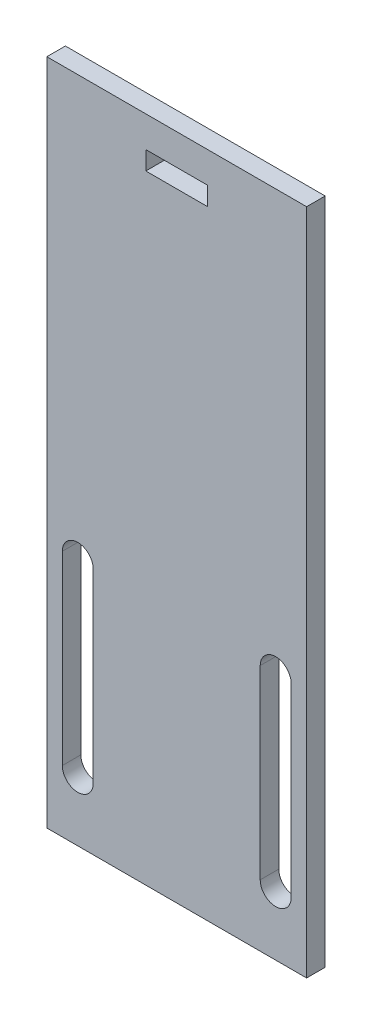
ISO-10303-21;
HEADER;
FILE_DESCRIPTION(('STEP AP214'),'2;1');
FILE_NAME('part.step','',(''),(''),'','','');
FILE_SCHEMA(('AUTOMOTIVE_DESIGN { 1 0 10303 214 1 1 1 1 }'));
ENDSEC;
DATA;
#1=APPLICATION_CONTEXT('core data for automotive mechanical design processes');
#2=APPLICATION_PROTOCOL_DEFINITION('international standard','automotive_design',2000,#1);
#3=PRODUCT_CONTEXT('',#1,'mechanical');
#4=PRODUCT('Part','Part','',(#3));
#5=PRODUCT_RELATED_PRODUCT_CATEGORY('part','',(#4));
#6=PRODUCT_DEFINITION_FORMATION('','',#4);
#7=PRODUCT_DEFINITION_CONTEXT('part definition',#1,'design');
#8=PRODUCT_DEFINITION('design','',#6,#7);
#9=PRODUCT_DEFINITION_SHAPE('','',#8);
#10=(LENGTH_UNIT() NAMED_UNIT(*) SI_UNIT(.MILLI.,.METRE.));
#11=(NAMED_UNIT(*) PLANE_ANGLE_UNIT() SI_UNIT($,.RADIAN.));
#12=(NAMED_UNIT(*) SI_UNIT($,.STERADIAN.) SOLID_ANGLE_UNIT());
#13=UNCERTAINTY_MEASURE_WITH_UNIT(LENGTH_MEASURE(1.E-05),#10,'distance_accuracy_value','');
#14=(GEOMETRIC_REPRESENTATION_CONTEXT(3) GLOBAL_UNCERTAINTY_ASSIGNED_CONTEXT((#13)) GLOBAL_UNIT_ASSIGNED_CONTEXT((#10,
#11,#12)) REPRESENTATION_CONTEXT('',''));
#15=CARTESIAN_POINT('',(0.,0.,0.));
#16=DIRECTION('',(0.,0.,1.));
#17=DIRECTION('',(1.,0.,0.));
#18=AXIS2_PLACEMENT_3D('',#15,#16,#17);
#19=CARTESIAN_POINT('',(0.,0.,3.));
#20=DIRECTION('',(0.,0.,-1.));
#21=DIRECTION('',(-1.,0.,0.));
#22=AXIS2_PLACEMENT_3D('',#19,#20,#21);
#23=PLANE('',#22);
#24=CARTESIAN_POINT('',(16.,-38.9099298904896,3.));
#25=DIRECTION('',(0.,0.,1.));
#26=DIRECTION('',(1.,0.,0.));
#27=AXIS2_PLACEMENT_3D('',#24,#25,#26);
#28=CIRCLE('',#27,2.5);
#29=CARTESIAN_POINT('',(18.5,-38.9099298904896,3.));
#30=VERTEX_POINT('',#29);
#31=CARTESIAN_POINT('',(13.5,-38.9099298904896,3.));
#32=VERTEX_POINT('',#31);
#33=EDGE_CURVE('E201',#30,#32,#28,.T.);
#34=ORIENTED_EDGE('',*,*,#33,.F.);
#35=DIRECTION('',(0.,1.,0.));
#36=VECTOR('',#35,1.);
#37=CARTESIAN_POINT('',(18.5,-38.9099298904896,3.));
#38=LINE('',#37,#36);
#39=CARTESIAN_POINT('',(18.5,-68.9099298904896,3.));
#40=VERTEX_POINT('',#39);
#41=EDGE_CURVE('E212',#40,#30,#38,.T.);
#42=ORIENTED_EDGE('',*,*,#41,.F.);
#43=CARTESIAN_POINT('',(16.,-68.9099298904896,3.));
#44=DIRECTION('',(0.,0.,1.));
#45=DIRECTION('',(1.,0.,0.));
#46=AXIS2_PLACEMENT_3D('',#43,#44,#45);
#47=CIRCLE('',#46,2.5);
#48=CARTESIAN_POINT('',(13.5,-68.9099298904896,3.));
#49=VERTEX_POINT('',#48);
#50=EDGE_CURVE('E208',#49,#40,#47,.T.);
#51=ORIENTED_EDGE('',*,*,#50,.F.);
#52=DIRECTION('',(0.,-1.,0.));
#53=VECTOR('',#52,1.);
#54=CARTESIAN_POINT('',(13.5,-38.9099298904896,3.));
#55=LINE('',#54,#53);
#56=EDGE_CURVE('E204',#32,#49,#55,.T.);
#57=ORIENTED_EDGE('',*,*,#56,.F.);
#58=EDGE_LOOP('',(#34,#42,#51,#57));
#59=FACE_BOUND('',#58,.T.);
#60=DIRECTION('',(-1.,0.,0.));
#61=VECTOR('',#60,1.);
#62=CARTESIAN_POINT('',(-5.00000000000001,29.0900701095105,3.));
#63=LINE('',#62,#61);
#64=CARTESIAN_POINT('',(21.,29.0900701095105,3.));
#65=VERTEX_POINT('',#64);
#66=CARTESIAN_POINT('',(-21.,29.0900701095105,3.));
#67=VERTEX_POINT('',#66);
#68=EDGE_CURVE('E287',#65,#67,#63,.T.);
#69=ORIENTED_EDGE('',*,*,#68,.T.);
#70=DIRECTION('',(0.,-1.,0.));
#71=VECTOR('',#70,1.);
#72=CARTESIAN_POINT('',(-21.,-78.9099298904895,3.));
#73=LINE('',#72,#71);
#74=CARTESIAN_POINT('',(-21.,-78.9099298904895,3.));
#75=VERTEX_POINT('',#74);
#76=EDGE_CURVE('E291',#67,#75,#73,.T.);
#77=ORIENTED_EDGE('',*,*,#76,.T.);
#78=DIRECTION('',(1.,0.,0.));
#79=VECTOR('',#78,1.);
#80=CARTESIAN_POINT('',(21.,-78.9099298904896,3.));
#81=LINE('',#80,#79);
#82=CARTESIAN_POINT('',(21.,-78.9099298904896,3.));
#83=VERTEX_POINT('',#82);
#84=EDGE_CURVE('E295',#75,#83,#81,.T.);
#85=ORIENTED_EDGE('',*,*,#84,.T.);
#86=DIRECTION('',(0.,1.,0.));
#87=VECTOR('',#86,1.);
#88=CARTESIAN_POINT('',(21.,-78.9099298904896,3.));
#89=LINE('',#88,#87);
#90=EDGE_CURVE('E298',#83,#65,#89,.T.);
#91=ORIENTED_EDGE('',*,*,#90,.T.);
#92=EDGE_LOOP('',(#69,#77,#85,#91));
#93=FACE_BOUND('',#92,.T.);
#94=CARTESIAN_POINT('',(-16.,-38.9099298904896,3.));
#95=DIRECTION('',(0.,0.,1.));
#96=DIRECTION('',(1.,0.,0.));
#97=AXIS2_PLACEMENT_3D('',#94,#95,#96);
#98=CIRCLE('',#97,2.5);
#99=CARTESIAN_POINT('',(-13.5,-38.9099298904896,3.));
#100=VERTEX_POINT('',#99);
#101=CARTESIAN_POINT('',(-18.5,-38.9099298904896,3.));
#102=VERTEX_POINT('',#101);
#103=EDGE_CURVE('E244',#100,#102,#98,.T.);
#104=ORIENTED_EDGE('',*,*,#103,.F.);
#105=DIRECTION('',(0.,1.,0.));
#106=VECTOR('',#105,1.);
#107=CARTESIAN_POINT('',(-13.5,-38.9099298904896,3.));
#108=LINE('',#107,#106);
#109=CARTESIAN_POINT('',(-13.5,-68.9099298904896,3.));
#110=VERTEX_POINT('',#109);
#111=EDGE_CURVE('E255',#110,#100,#108,.T.);
#112=ORIENTED_EDGE('',*,*,#111,.F.);
#113=CARTESIAN_POINT('',(-16.,-68.9099298904896,3.));
#114=DIRECTION('',(0.,0.,1.));
#115=DIRECTION('',(1.,0.,0.));
#116=AXIS2_PLACEMENT_3D('',#113,#114,#115);
#117=CIRCLE('',#116,2.5);
#118=CARTESIAN_POINT('',(-18.5,-68.9099298904896,3.));
#119=VERTEX_POINT('',#118);
#120=EDGE_CURVE('E251',#119,#110,#117,.T.);
#121=ORIENTED_EDGE('',*,*,#120,.F.);
#122=DIRECTION('',(0.,-1.,0.));
#123=VECTOR('',#122,1.);
#124=CARTESIAN_POINT('',(-18.5,-38.9099298904896,3.));
#125=LINE('',#124,#123);
#126=EDGE_CURVE('E247',#102,#119,#125,.T.);
#127=ORIENTED_EDGE('',*,*,#126,.F.);
#128=EDGE_LOOP('',(#104,#112,#121,#127));
#129=FACE_BOUND('',#128,.T.);
#130=DIRECTION('',(0.,-1.,0.));
#131=VECTOR('',#130,1.);
#132=CARTESIAN_POINT('',(-5.00000000000001,24.0900701095105,3.));
#133=LINE('',#132,#131);
#134=CARTESIAN_POINT('',(-5.00000000000001,24.0900701095105,3.));
#135=VERTEX_POINT('',#134);
#136=CARTESIAN_POINT('',(-5.00000000000001,21.0900701095105,3.));
#137=VERTEX_POINT('',#136);
#138=EDGE_CURVE('E153',#135,#137,#133,.T.);
#139=ORIENTED_EDGE('',*,*,#138,.F.);
#140=DIRECTION('',(-1.,0.,0.));
#141=VECTOR('',#140,1.);
#142=CARTESIAN_POINT('',(4.99999999999999,24.0900701095105,3.));
#143=LINE('',#142,#141);
#144=CARTESIAN_POINT('',(4.99999999999999,24.0900701095105,3.));
#145=VERTEX_POINT('',#144);
#146=EDGE_CURVE('E179',#145,#135,#143,.T.);
#147=ORIENTED_EDGE('',*,*,#146,.F.);
#148=DIRECTION('',(0.,1.,0.));
#149=VECTOR('',#148,1.);
#150=CARTESIAN_POINT('',(4.99999999999999,24.0900701095105,3.));
#151=LINE('',#150,#149);
#152=CARTESIAN_POINT('',(4.99999999999999,21.0900701095105,3.));
#153=VERTEX_POINT('',#152);
#154=EDGE_CURVE('E175',#153,#145,#151,.T.);
#155=ORIENTED_EDGE('',*,*,#154,.F.);
#156=DIRECTION('',(1.,0.,0.));
#157=VECTOR('',#156,1.);
#158=CARTESIAN_POINT('',(4.99999999999999,21.0900701095105,3.));
#159=LINE('',#158,#157);
#160=EDGE_CURVE('E162',#137,#153,#159,.T.);
#161=ORIENTED_EDGE('',*,*,#160,.F.);
#162=EDGE_LOOP('',(#139,#147,#155,#161));
#163=FACE_BOUND('',#162,.T.);
#164=ADVANCED_FACE('F39',(#59,#93,#129,#163),#23,.F.);
#165=CARTESIAN_POINT('',(0.,0.,0.));
#166=DIRECTION('',(0.,0.,-1.));
#167=DIRECTION('',(-1.,0.,0.));
#168=AXIS2_PLACEMENT_3D('',#165,#166,#167);
#169=PLANE('',#168);
#170=DIRECTION('',(0.,-1.,0.));
#171=VECTOR('',#170,1.);
#172=CARTESIAN_POINT('',(-21.,-78.9099298904895,0.));
#173=LINE('',#172,#171);
#174=CARTESIAN_POINT('',(-21.,29.0900701095105,0.));
#175=VERTEX_POINT('',#174);
#176=CARTESIAN_POINT('',(-21.,-78.9099298904895,0.));
#177=VERTEX_POINT('',#176);
#178=EDGE_CURVE('E286',#175,#177,#173,.T.);
#179=ORIENTED_EDGE('',*,*,#178,.F.);
#180=DIRECTION('',(-1.,0.,0.));
#181=VECTOR('',#180,1.);
#182=CARTESIAN_POINT('',(21.,29.0900701095105,0.));
#183=LINE('',#182,#181);
#184=CARTESIAN_POINT('',(21.,29.0900701095105,0.));
#185=VERTEX_POINT('',#184);
#186=EDGE_CURVE('E292',#185,#175,#183,.T.);
#187=ORIENTED_EDGE('',*,*,#186,.F.);
#188=DIRECTION('',(0.,1.,0.));
#189=VECTOR('',#188,1.);
#190=CARTESIAN_POINT('',(21.,-78.9099298904896,0.));
#191=LINE('',#190,#189);
#192=CARTESIAN_POINT('',(21.,-78.9099298904896,0.));
#193=VERTEX_POINT('',#192);
#194=EDGE_CURVE('E308',#193,#185,#191,.T.);
#195=ORIENTED_EDGE('',*,*,#194,.F.);
#196=DIRECTION('',(1.,0.,0.));
#197=VECTOR('',#196,1.);
#198=CARTESIAN_POINT('',(21.,-78.9099298904896,0.));
#199=LINE('',#198,#197);
#200=EDGE_CURVE('E305',#177,#193,#199,.T.);
#201=ORIENTED_EDGE('',*,*,#200,.F.);
#202=EDGE_LOOP('',(#179,#187,#195,#201));
#203=FACE_BOUND('',#202,.T.);
#204=DIRECTION('',(0.,1.,0.));
#205=VECTOR('',#204,1.);
#206=CARTESIAN_POINT('',(-13.5,-38.9099298904896,0.));
#207=LINE('',#206,#205);
#208=CARTESIAN_POINT('',(-13.5,-68.9099298904896,0.));
#209=VERTEX_POINT('',#208);
#210=CARTESIAN_POINT('',(-13.5,-38.9099298904896,0.));
#211=VERTEX_POINT('',#210);
#212=EDGE_CURVE('E248',#209,#211,#207,.T.);
#213=ORIENTED_EDGE('',*,*,#212,.T.);
#214=CARTESIAN_POINT('',(-16.,-38.9099298904896,0.));
#215=DIRECTION('',(0.,0.,1.));
#216=DIRECTION('',(1.,0.,0.));
#217=AXIS2_PLACEMENT_3D('',#214,#215,#216);
#218=CIRCLE('',#217,2.5);
#219=CARTESIAN_POINT('',(-18.5,-38.9099298904896,0.));
#220=VERTEX_POINT('',#219);
#221=EDGE_CURVE('E243',#211,#220,#218,.T.);
#222=ORIENTED_EDGE('',*,*,#221,.T.);
#223=DIRECTION('',(0.,-1.,0.));
#224=VECTOR('',#223,1.);
#225=CARTESIAN_POINT('',(-18.5,-38.9099298904896,0.));
#226=LINE('',#225,#224);
#227=CARTESIAN_POINT('',(-18.5,-68.9099298904896,0.));
#228=VERTEX_POINT('',#227);
#229=EDGE_CURVE('E262',#220,#228,#226,.T.);
#230=ORIENTED_EDGE('',*,*,#229,.T.);
#231=CARTESIAN_POINT('',(-16.,-68.9099298904896,0.));
#232=DIRECTION('',(0.,0.,1.));
#233=DIRECTION('',(1.,0.,0.));
#234=AXIS2_PLACEMENT_3D('',#231,#232,#233);
#235=CIRCLE('',#234,2.5);
#236=EDGE_CURVE('E266',#228,#209,#235,.T.);
#237=ORIENTED_EDGE('',*,*,#236,.T.);
#238=EDGE_LOOP('',(#213,#222,#230,#237));
#239=FACE_BOUND('',#238,.T.);
#240=DIRECTION('',(0.,1.,0.));
#241=VECTOR('',#240,1.);
#242=CARTESIAN_POINT('',(18.5,-38.9099298904896,0.));
#243=LINE('',#242,#241);
#244=CARTESIAN_POINT('',(18.5,-68.9099298904896,0.));
#245=VERTEX_POINT('',#244);
#246=CARTESIAN_POINT('',(18.5,-38.9099298904896,0.));
#247=VERTEX_POINT('',#246);
#248=EDGE_CURVE('E205',#245,#247,#243,.T.);
#249=ORIENTED_EDGE('',*,*,#248,.T.);
#250=CARTESIAN_POINT('',(16.,-38.9099298904896,0.));
#251=DIRECTION('',(0.,0.,1.));
#252=DIRECTION('',(1.,0.,0.));
#253=AXIS2_PLACEMENT_3D('',#250,#251,#252);
#254=CIRCLE('',#253,2.5);
#255=CARTESIAN_POINT('',(13.5,-38.9099298904896,0.));
#256=VERTEX_POINT('',#255);
#257=EDGE_CURVE('E171',#247,#256,#254,.T.);
#258=ORIENTED_EDGE('',*,*,#257,.T.);
#259=DIRECTION('',(0.,-1.,0.));
#260=VECTOR('',#259,1.);
#261=CARTESIAN_POINT('',(13.5,-38.9099298904896,0.));
#262=LINE('',#261,#260);
#263=CARTESIAN_POINT('',(13.5,-68.9099298904896,0.));
#264=VERTEX_POINT('',#263);
#265=EDGE_CURVE('E219',#256,#264,#262,.T.);
#266=ORIENTED_EDGE('',*,*,#265,.T.);
#267=CARTESIAN_POINT('',(16.,-68.9099298904896,0.));
#268=DIRECTION('',(0.,0.,1.));
#269=DIRECTION('',(1.,0.,0.));
#270=AXIS2_PLACEMENT_3D('',#267,#268,#269);
#271=CIRCLE('',#270,2.5);
#272=EDGE_CURVE('E223',#264,#245,#271,.T.);
#273=ORIENTED_EDGE('',*,*,#272,.T.);
#274=EDGE_LOOP('',(#249,#258,#266,#273));
#275=FACE_BOUND('',#274,.T.);
#276=DIRECTION('',(-1.,0.,0.));
#277=VECTOR('',#276,1.);
#278=CARTESIAN_POINT('',(4.99999999999999,24.0900701095105,0.));
#279=LINE('',#278,#277);
#280=CARTESIAN_POINT('',(4.99999999999999,24.0900701095105,0.));
#281=VERTEX_POINT('',#280);
#282=CARTESIAN_POINT('',(-5.00000000000001,24.0900701095105,0.));
#283=VERTEX_POINT('',#282);
#284=EDGE_CURVE('E163',#281,#283,#279,.T.);
#285=ORIENTED_EDGE('',*,*,#284,.T.);
#286=DIRECTION('',(0.,-1.,0.));
#287=VECTOR('',#286,1.);
#288=CARTESIAN_POINT('',(-5.00000000000001,24.0900701095105,0.));
#289=LINE('',#288,#287);
#290=CARTESIAN_POINT('',(-5.00000000000001,21.0900701095105,0.));
#291=VERTEX_POINT('',#290);
#292=EDGE_CURVE('E63',#283,#291,#289,.T.);
#293=ORIENTED_EDGE('',*,*,#292,.T.);
#294=DIRECTION('',(1.,0.,0.));
#295=VECTOR('',#294,1.);
#296=CARTESIAN_POINT('',(4.99999999999999,21.0900701095105,0.));
#297=LINE('',#296,#295);
#298=CARTESIAN_POINT('',(4.99999999999999,21.0900701095105,0.));
#299=VERTEX_POINT('',#298);
#300=EDGE_CURVE('E169',#291,#299,#297,.T.);
#301=ORIENTED_EDGE('',*,*,#300,.T.);
#302=DIRECTION('',(0.,1.,0.));
#303=VECTOR('',#302,1.);
#304=CARTESIAN_POINT('',(4.99999999999999,24.0900701095105,0.));
#305=LINE('',#304,#303);
#306=EDGE_CURVE('E188',#299,#281,#305,.T.);
#307=ORIENTED_EDGE('',*,*,#306,.T.);
#308=EDGE_LOOP('',(#285,#293,#301,#307));
#309=FACE_BOUND('',#308,.T.);
#310=ADVANCED_FACE('F331',(#203,#239,#275,#309),#169,.T.);
#311=CARTESIAN_POINT('',(-21.,-78.9099298904895,3.));
#312=DIRECTION('',(1.,0.,0.));
#313=DIRECTION('',(0.,0.,-1.));
#314=AXIS2_PLACEMENT_3D('',#311,#312,#313);
#315=PLANE('',#314);
#316=ORIENTED_EDGE('',*,*,#178,.T.);
#317=DIRECTION('',(0.,0.,-1.));
#318=VECTOR('',#317,1.);
#319=CARTESIAN_POINT('',(-21.,-78.9099298904895,3.));
#320=LINE('',#319,#318);
#321=EDGE_CURVE('E48',#75,#177,#320,.T.);
#322=ORIENTED_EDGE('',*,*,#321,.F.);
#323=ORIENTED_EDGE('',*,*,#76,.F.);
#324=DIRECTION('',(0.,0.,-1.));
#325=VECTOR('',#324,1.);
#326=CARTESIAN_POINT('',(-21.,29.0900701095105,3.));
#327=LINE('',#326,#325);
#328=EDGE_CURVE('E11',#67,#175,#327,.T.);
#329=ORIENTED_EDGE('',*,*,#328,.T.);
#330=EDGE_LOOP('',(#316,#322,#323,#329));
#331=FACE_BOUND('',#330,.T.);
#332=ADVANCED_FACE('F41',(#331),#315,.F.);
#333=CARTESIAN_POINT('',(21.,-78.9099298904896,3.));
#334=DIRECTION('',(0.,1.,0.));
#335=DIRECTION('',(-1.,0.,0.));
#336=AXIS2_PLACEMENT_3D('',#333,#334,#335);
#337=PLANE('',#336);
#338=ORIENTED_EDGE('',*,*,#200,.T.);
#339=DIRECTION('',(0.,0.,-1.));
#340=VECTOR('',#339,1.);
#341=CARTESIAN_POINT('',(21.,-78.9099298904896,3.));
#342=LINE('',#341,#340);
#343=EDGE_CURVE('E316',#83,#193,#342,.T.);
#344=ORIENTED_EDGE('',*,*,#343,.F.);
#345=ORIENTED_EDGE('',*,*,#84,.F.);
#346=ORIENTED_EDGE('',*,*,#321,.T.);
#347=EDGE_LOOP('',(#338,#344,#345,#346));
#348=FACE_BOUND('',#347,.T.);
#349=ADVANCED_FACE('F325',(#348),#337,.F.);
#350=CARTESIAN_POINT('',(21.,-78.9099298904896,3.));
#351=DIRECTION('',(-1.,0.,0.));
#352=DIRECTION('',(0.,0.,1.));
#353=AXIS2_PLACEMENT_3D('',#350,#351,#352);
#354=PLANE('',#353);
#355=ORIENTED_EDGE('',*,*,#194,.T.);
#356=DIRECTION('',(0.,0.,-1.));
#357=VECTOR('',#356,1.);
#358=CARTESIAN_POINT('',(21.,29.0900701095105,3.));
#359=LINE('',#358,#357);
#360=EDGE_CURVE('E302',#65,#185,#359,.T.);
#361=ORIENTED_EDGE('',*,*,#360,.F.);
#362=ORIENTED_EDGE('',*,*,#90,.F.);
#363=ORIENTED_EDGE('',*,*,#343,.T.);
#364=EDGE_LOOP('',(#355,#361,#362,#363));
#365=FACE_BOUND('',#364,.T.);
#366=ADVANCED_FACE('F336',(#365),#354,.F.);
#367=CARTESIAN_POINT('',(21.,29.0900701095105,3.));
#368=DIRECTION('',(0.,-1.,0.));
#369=DIRECTION('',(0.,0.,-1.));
#370=AXIS2_PLACEMENT_3D('',#367,#368,#369);
#371=PLANE('',#370);
#372=ORIENTED_EDGE('',*,*,#186,.T.);
#373=ORIENTED_EDGE('',*,*,#328,.F.);
#374=ORIENTED_EDGE('',*,*,#68,.F.);
#375=ORIENTED_EDGE('',*,*,#360,.T.);
#376=EDGE_LOOP('',(#372,#373,#374,#375));
#377=FACE_BOUND('',#376,.T.);
#378=ADVANCED_FACE('F339',(#377),#371,.F.);
#379=CARTESIAN_POINT('',(-16.,-38.9099298904896,3.));
#380=DIRECTION('',(0.,0.,-1.));
#381=DIRECTION('',(-1.,0.,0.));
#382=AXIS2_PLACEMENT_3D('',#379,#380,#381);
#383=CYLINDRICAL_SURFACE('',#382,2.5);
#384=ORIENTED_EDGE('',*,*,#221,.F.);
#385=DIRECTION('',(0.,0.,-1.));
#386=VECTOR('',#385,1.);
#387=CARTESIAN_POINT('',(-13.5,-38.9099298904896,3.));
#388=LINE('',#387,#386);
#389=EDGE_CURVE('E258',#100,#211,#388,.T.);
#390=ORIENTED_EDGE('',*,*,#389,.F.);
#391=ORIENTED_EDGE('',*,*,#103,.T.);
#392=DIRECTION('',(0.,0.,-1.));
#393=VECTOR('',#392,1.);
#394=CARTESIAN_POINT('',(-18.5,-38.9099298904896,3.));
#395=LINE('',#394,#393);
#396=EDGE_CURVE('E282',#102,#220,#395,.T.);
#397=ORIENTED_EDGE('',*,*,#396,.T.);
#398=EDGE_LOOP('',(#384,#390,#391,#397));
#399=FACE_BOUND('',#398,.T.);
#400=ADVANCED_FACE('F356',(#399),#383,.F.);
#401=CARTESIAN_POINT('',(-18.5,-38.9099298904896,3.));
#402=DIRECTION('',(1.,0.,0.));
#403=DIRECTION('',(0.,1.,0.));
#404=AXIS2_PLACEMENT_3D('',#401,#402,#403);
#405=PLANE('',#404);
#406=ORIENTED_EDGE('',*,*,#229,.F.);
#407=ORIENTED_EDGE('',*,*,#396,.F.);
#408=ORIENTED_EDGE('',*,*,#126,.T.);
#409=DIRECTION('',(0.,0.,-1.));
#410=VECTOR('',#409,1.);
#411=CARTESIAN_POINT('',(-18.5,-68.9099298904896,3.));
#412=LINE('',#411,#410);
#413=EDGE_CURVE('E279',#119,#228,#412,.T.);
#414=ORIENTED_EDGE('',*,*,#413,.T.);
#415=EDGE_LOOP('',(#406,#407,#408,#414));
#416=FACE_BOUND('',#415,.T.);
#417=ADVANCED_FACE('F376',(#416),#405,.T.);
#418=CARTESIAN_POINT('',(-16.,-68.9099298904896,3.));
#419=DIRECTION('',(0.,0.,-1.));
#420=DIRECTION('',(-1.,0.,0.));
#421=AXIS2_PLACEMENT_3D('',#418,#419,#420);
#422=CYLINDRICAL_SURFACE('',#421,2.5);
#423=ORIENTED_EDGE('',*,*,#236,.F.);
#424=ORIENTED_EDGE('',*,*,#413,.F.);
#425=ORIENTED_EDGE('',*,*,#120,.T.);
#426=DIRECTION('',(0.,0.,-1.));
#427=VECTOR('',#426,1.);
#428=CARTESIAN_POINT('',(-13.5,-68.9099298904896,3.));
#429=LINE('',#428,#427);
#430=EDGE_CURVE('E276',#110,#209,#429,.T.);
#431=ORIENTED_EDGE('',*,*,#430,.T.);
#432=EDGE_LOOP('',(#423,#424,#425,#431));
#433=FACE_BOUND('',#432,.T.);
#434=ADVANCED_FACE('F383',(#433),#422,.F.);
#435=CARTESIAN_POINT('',(-13.5,-38.9099298904896,3.));
#436=DIRECTION('',(-1.,0.,0.));
#437=DIRECTION('',(0.,-1.,0.));
#438=AXIS2_PLACEMENT_3D('',#435,#436,#437);
#439=PLANE('',#438);
#440=ORIENTED_EDGE('',*,*,#212,.F.);
#441=ORIENTED_EDGE('',*,*,#430,.F.);
#442=ORIENTED_EDGE('',*,*,#111,.T.);
#443=ORIENTED_EDGE('',*,*,#389,.T.);
#444=EDGE_LOOP('',(#440,#441,#442,#443));
#445=FACE_BOUND('',#444,.T.);
#446=ADVANCED_FACE('F390',(#445),#439,.T.);
#447=CARTESIAN_POINT('',(16.,-38.9099298904896,3.));
#448=DIRECTION('',(0.,0.,-1.));
#449=DIRECTION('',(-1.,0.,0.));
#450=AXIS2_PLACEMENT_3D('',#447,#448,#449);
#451=CYLINDRICAL_SURFACE('',#450,2.5);
#452=ORIENTED_EDGE('',*,*,#257,.F.);
#453=DIRECTION('',(0.,0.,-1.));
#454=VECTOR('',#453,1.);
#455=CARTESIAN_POINT('',(18.5,-38.9099298904896,3.));
#456=LINE('',#455,#454);
#457=EDGE_CURVE('E215',#30,#247,#456,.T.);
#458=ORIENTED_EDGE('',*,*,#457,.F.);
#459=ORIENTED_EDGE('',*,*,#33,.T.);
#460=DIRECTION('',(0.,0.,-1.));
#461=VECTOR('',#460,1.);
#462=CARTESIAN_POINT('',(13.5,-38.9099298904896,3.));
#463=LINE('',#462,#461);
#464=EDGE_CURVE('E239',#32,#256,#463,.T.);
#465=ORIENTED_EDGE('',*,*,#464,.T.);
#466=EDGE_LOOP('',(#452,#458,#459,#465));
#467=FACE_BOUND('',#466,.T.);
#468=ADVANCED_FACE('F398',(#467),#451,.F.);
#469=CARTESIAN_POINT('',(13.5,-38.9099298904896,3.));
#470=DIRECTION('',(1.,0.,0.));
#471=DIRECTION('',(0.,1.,0.));
#472=AXIS2_PLACEMENT_3D('',#469,#470,#471);
#473=PLANE('',#472);
#474=ORIENTED_EDGE('',*,*,#265,.F.);
#475=ORIENTED_EDGE('',*,*,#464,.F.);
#476=ORIENTED_EDGE('',*,*,#56,.T.);
#477=DIRECTION('',(0.,0.,-1.));
#478=VECTOR('',#477,1.);
#479=CARTESIAN_POINT('',(13.5,-68.9099298904896,3.));
#480=LINE('',#479,#478);
#481=EDGE_CURVE('E236',#49,#264,#480,.T.);
#482=ORIENTED_EDGE('',*,*,#481,.T.);
#483=EDGE_LOOP('',(#474,#475,#476,#482));
#484=FACE_BOUND('',#483,.T.);
#485=ADVANCED_FACE('F406',(#484),#473,.T.);
#486=CARTESIAN_POINT('',(16.,-68.9099298904896,3.));
#487=DIRECTION('',(0.,0.,-1.));
#488=DIRECTION('',(-1.,0.,0.));
#489=AXIS2_PLACEMENT_3D('',#486,#487,#488);
#490=CYLINDRICAL_SURFACE('',#489,2.5);
#491=ORIENTED_EDGE('',*,*,#272,.F.);
#492=ORIENTED_EDGE('',*,*,#481,.F.);
#493=ORIENTED_EDGE('',*,*,#50,.T.);
#494=DIRECTION('',(0.,0.,-1.));
#495=VECTOR('',#494,1.);
#496=CARTESIAN_POINT('',(18.5,-68.9099298904896,3.));
#497=LINE('',#496,#495);
#498=EDGE_CURVE('E233',#40,#245,#497,.T.);
#499=ORIENTED_EDGE('',*,*,#498,.T.);
#500=EDGE_LOOP('',(#491,#492,#493,#499));
#501=FACE_BOUND('',#500,.T.);
#502=ADVANCED_FACE('F414',(#501),#490,.F.);
#503=CARTESIAN_POINT('',(18.5,-38.9099298904896,3.));
#504=DIRECTION('',(-1.,0.,0.));
#505=DIRECTION('',(0.,0.,1.));
#506=AXIS2_PLACEMENT_3D('',#503,#504,#505);
#507=PLANE('',#506);
#508=ORIENTED_EDGE('',*,*,#248,.F.);
#509=ORIENTED_EDGE('',*,*,#498,.F.);
#510=ORIENTED_EDGE('',*,*,#41,.T.);
#511=ORIENTED_EDGE('',*,*,#457,.T.);
#512=EDGE_LOOP('',(#508,#509,#510,#511));
#513=FACE_BOUND('',#512,.T.);
#514=ADVANCED_FACE('F422',(#513),#507,.T.);
#515=CARTESIAN_POINT('',(-5.00000000000001,24.0900701095105,3.));
#516=DIRECTION('',(1.,0.,0.));
#517=DIRECTION('',(0.,1.,0.));
#518=AXIS2_PLACEMENT_3D('',#515,#516,#517);
#519=PLANE('',#518);
#520=ORIENTED_EDGE('',*,*,#292,.F.);
#521=DIRECTION('',(0.,0.,-1.));
#522=VECTOR('',#521,1.);
#523=CARTESIAN_POINT('',(-5.00000000000001,24.0900701095105,3.));
#524=LINE('',#523,#522);
#525=EDGE_CURVE('E157',#135,#283,#524,.T.);
#526=ORIENTED_EDGE('',*,*,#525,.F.);
#527=ORIENTED_EDGE('',*,*,#138,.T.);
#528=DIRECTION('',(0.,0.,-1.));
#529=VECTOR('',#528,1.);
#530=CARTESIAN_POINT('',(-5.00000000000001,21.0900701095105,3.));
#531=LINE('',#530,#529);
#532=EDGE_CURVE('E156',#137,#291,#531,.T.);
#533=ORIENTED_EDGE('',*,*,#532,.T.);
#534=EDGE_LOOP('',(#520,#526,#527,#533));
#535=FACE_BOUND('',#534,.T.);
#536=ADVANCED_FACE('F155',(#535),#519,.T.);
#537=CARTESIAN_POINT('',(4.99999999999999,21.0900701095105,3.));
#538=DIRECTION('',(0.,1.,0.));
#539=DIRECTION('',(0.,0.,1.));
#540=AXIS2_PLACEMENT_3D('',#537,#538,#539);
#541=PLANE('',#540);
#542=ORIENTED_EDGE('',*,*,#300,.F.);
#543=ORIENTED_EDGE('',*,*,#532,.F.);
#544=ORIENTED_EDGE('',*,*,#160,.T.);
#545=DIRECTION('',(0.,0.,-1.));
#546=VECTOR('',#545,1.);
#547=CARTESIAN_POINT('',(4.99999999999999,21.0900701095105,3.));
#548=LINE('',#547,#546);
#549=EDGE_CURVE('E172',#153,#299,#548,.T.);
#550=ORIENTED_EDGE('',*,*,#549,.T.);
#551=EDGE_LOOP('',(#542,#543,#544,#550));
#552=FACE_BOUND('',#551,.T.);
#553=ADVANCED_FACE('F166',(#552),#541,.T.);
#554=CARTESIAN_POINT('',(4.99999999999999,24.0900701095105,3.));
#555=DIRECTION('',(-1.,0.,0.));
#556=DIRECTION('',(0.,-1.,0.));
#557=AXIS2_PLACEMENT_3D('',#554,#555,#556);
#558=PLANE('',#557);
#559=ORIENTED_EDGE('',*,*,#306,.F.);
#560=ORIENTED_EDGE('',*,*,#549,.F.);
#561=ORIENTED_EDGE('',*,*,#154,.T.);
#562=DIRECTION('',(0.,0.,-1.));
#563=VECTOR('',#562,1.);
#564=CARTESIAN_POINT('',(4.99999999999999,24.0900701095105,3.));
#565=LINE('',#564,#563);
#566=EDGE_CURVE('E55',#145,#281,#565,.T.);
#567=ORIENTED_EDGE('',*,*,#566,.T.);
#568=EDGE_LOOP('',(#559,#560,#561,#567));
#569=FACE_BOUND('',#568,.T.);
#570=ADVANCED_FACE('F443',(#569),#558,.T.);
#571=CARTESIAN_POINT('',(4.99999999999999,24.0900701095105,3.));
#572=DIRECTION('',(0.,-1.,0.));
#573=DIRECTION('',(0.,0.,-1.));
#574=AXIS2_PLACEMENT_3D('',#571,#572,#573);
#575=PLANE('',#574);
#576=ORIENTED_EDGE('',*,*,#284,.F.);
#577=ORIENTED_EDGE('',*,*,#566,.F.);
#578=ORIENTED_EDGE('',*,*,#146,.T.);
#579=ORIENTED_EDGE('',*,*,#525,.T.);
#580=EDGE_LOOP('',(#576,#577,#578,#579));
#581=FACE_BOUND('',#580,.T.);
#582=ADVANCED_FACE('F450',(#581),#575,.T.);
#583=CLOSED_SHELL('',(#164,#310,#332,#349,#366,#378,#400,#417,#434,#446,#468,#485,#502,#514,
#536,#553,#570,#582));
#584=MANIFOLD_SOLID_BREP('B2',#583);
#585=ADVANCED_BREP_SHAPE_REPRESENTATION('',(#18,#584),#14);
#586=SHAPE_DEFINITION_REPRESENTATION(#9,#585);
ENDSEC;
END-ISO-10303-21;
